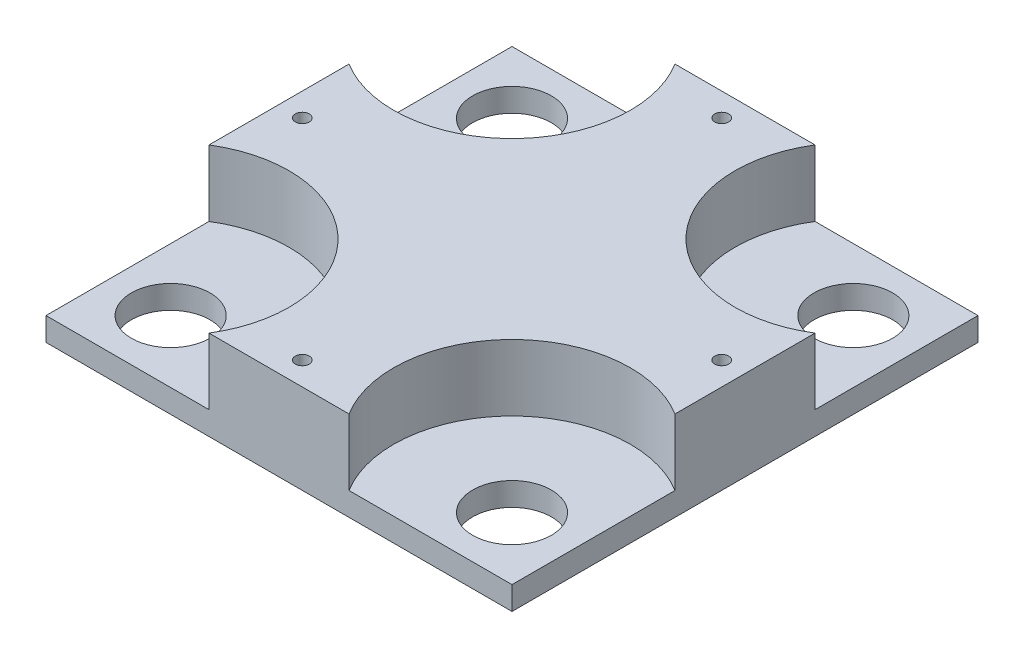
ISO-10303-21;
HEADER;
FILE_DESCRIPTION(('STEP AP214'),'2;1');
FILE_NAME('part.step','',(''),(''),'','','');
FILE_SCHEMA(('AUTOMOTIVE_DESIGN { 1 0 10303 214 1 1 1 1 }'));
ENDSEC;
DATA;
#1=APPLICATION_CONTEXT('core data for automotive mechanical design processes');
#2=APPLICATION_PROTOCOL_DEFINITION('international standard','automotive_design',2000,#1);
#3=PRODUCT_CONTEXT('',#1,'mechanical');
#4=PRODUCT('Part','Part','',(#3));
#5=PRODUCT_RELATED_PRODUCT_CATEGORY('part','',(#4));
#6=PRODUCT_DEFINITION_FORMATION('','',#4);
#7=PRODUCT_DEFINITION_CONTEXT('part definition',#1,'design');
#8=PRODUCT_DEFINITION('design','',#6,#7);
#9=PRODUCT_DEFINITION_SHAPE('','',#8);
#10=(LENGTH_UNIT() NAMED_UNIT(*) SI_UNIT(.MILLI.,.METRE.));
#11=(NAMED_UNIT(*) PLANE_ANGLE_UNIT() SI_UNIT($,.RADIAN.));
#12=(NAMED_UNIT(*) SI_UNIT($,.STERADIAN.) SOLID_ANGLE_UNIT());
#13=UNCERTAINTY_MEASURE_WITH_UNIT(LENGTH_MEASURE(1.E-05),#10,'distance_accuracy_value','');
#14=(GEOMETRIC_REPRESENTATION_CONTEXT(3) GLOBAL_UNCERTAINTY_ASSIGNED_CONTEXT((#13)) GLOBAL_UNIT_ASSIGNED_CONTEXT((#10,
#11,#12)) REPRESENTATION_CONTEXT('',''));
#15=CARTESIAN_POINT('',(0.,0.,0.));
#16=DIRECTION('',(0.,0.,1.));
#17=DIRECTION('',(1.,0.,0.));
#18=AXIS2_PLACEMENT_3D('',#15,#16,#17);
#19=CARTESIAN_POINT('',(0.,19.224,0.));
#20=DIRECTION('',(0.,-1.,0.));
#21=DIRECTION('',(0.,0.,-1.));
#22=AXIS2_PLACEMENT_3D('',#19,#20,#21);
#23=CYLINDRICAL_SURFACE('',#22,8.4375);
#24=CARTESIAN_POINT('',(0.,0.,0.));
#25=DIRECTION('',(0.,1.,0.));
#26=DIRECTION('',(0.,0.,1.));
#27=AXIS2_PLACEMENT_3D('',#24,#25,#26);
#28=CIRCLE('',#27,8.4375);
#29=CARTESIAN_POINT('',(0.,0.,8.4375));
#30=VERTEX_POINT('',#29);
#31=EDGE_CURVE('E177',#30,#30,#28,.T.);
#32=ORIENTED_EDGE('',*,*,#31,.F.);
#33=EDGE_LOOP('',(#32));
#34=FACE_BOUND('',#33,.T.);
#35=CARTESIAN_POINT('',(0.,5.,0.));
#36=DIRECTION('',(0.,1.,0.));
#37=DIRECTION('',(0.,0.,1.));
#38=AXIS2_PLACEMENT_3D('',#35,#36,#37);
#39=CIRCLE('',#38,8.4375);
#40=CARTESIAN_POINT('',(0.,5.,8.4375));
#41=VERTEX_POINT('',#40);
#42=EDGE_CURVE('E218',#41,#41,#39,.T.);
#43=ORIENTED_EDGE('',*,*,#42,.T.);
#44=EDGE_LOOP('',(#43));
#45=FACE_BOUND('',#44,.T.);
#46=ADVANCED_FACE('F39',(#34,#45),#23,.F.);
#47=CARTESIAN_POINT('',(9.64506252643105E-13,19.224,-73.250000000001));
#48=DIRECTION('',(0.,-1.,0.));
#49=DIRECTION('',(0.,0.,-1.));
#50=AXIS2_PLACEMENT_3D('',#47,#48,#49);
#51=CYLINDRICAL_SURFACE('',#50,8.43749999999876);
#52=CARTESIAN_POINT('',(9.64506252643105E-13,0.,-73.250000000001));
#53=DIRECTION('',(0.,1.,0.));
#54=DIRECTION('',(0.,0.,1.));
#55=AXIS2_PLACEMENT_3D('',#52,#53,#54);
#56=CIRCLE('',#55,8.43749999999876);
#57=CARTESIAN_POINT('',(9.64506252643105E-13,0.,-64.8125000000022));
#58=VERTEX_POINT('',#57);
#59=EDGE_CURVE('E300',#58,#58,#56,.T.);
#60=ORIENTED_EDGE('',*,*,#59,.F.);
#61=EDGE_LOOP('',(#60));
#62=FACE_BOUND('',#61,.T.);
#63=CARTESIAN_POINT('',(9.64506252643105E-13,5.,-73.250000000001));
#64=DIRECTION('',(0.,1.,0.));
#65=DIRECTION('',(0.,0.,1.));
#66=AXIS2_PLACEMENT_3D('',#63,#64,#65);
#67=CIRCLE('',#66,8.43749999999876);
#68=CARTESIAN_POINT('',(9.64506252643105E-13,5.,-64.8125000000022));
#69=VERTEX_POINT('',#68);
#70=EDGE_CURVE('E212',#69,#69,#67,.T.);
#71=ORIENTED_EDGE('',*,*,#70,.T.);
#72=EDGE_LOOP('',(#71));
#73=FACE_BOUND('',#72,.T.);
#74=ADVANCED_FACE('F364',(#62,#73),#51,.F.);
#75=CARTESIAN_POINT('',(73.250000000002,19.224,-73.25));
#76=DIRECTION('',(0.,-1.,0.));
#77=DIRECTION('',(0.,0.,-1.));
#78=AXIS2_PLACEMENT_3D('',#75,#76,#77);
#79=CYLINDRICAL_SURFACE('',#78,8.43749999999812);
#80=CARTESIAN_POINT('',(73.250000000002,0.,-73.25));
#81=DIRECTION('',(0.,1.,0.));
#82=DIRECTION('',(0.,0.,1.));
#83=AXIS2_PLACEMENT_3D('',#80,#81,#82);
#84=CIRCLE('',#83,8.43749999999812);
#85=CARTESIAN_POINT('',(73.250000000002,0.,-64.8125000000019));
#86=VERTEX_POINT('',#85);
#87=EDGE_CURVE('E296',#86,#86,#84,.T.);
#88=ORIENTED_EDGE('',*,*,#87,.F.);
#89=EDGE_LOOP('',(#88));
#90=FACE_BOUND('',#89,.T.);
#91=CARTESIAN_POINT('',(73.250000000002,5.,-73.25));
#92=DIRECTION('',(0.,1.,0.));
#93=DIRECTION('',(0.,0.,1.));
#94=AXIS2_PLACEMENT_3D('',#91,#92,#93);
#95=CIRCLE('',#94,8.43749999999812);
#96=CARTESIAN_POINT('',(73.250000000002,5.,-64.8125000000019));
#97=VERTEX_POINT('',#96);
#98=EDGE_CURVE('E207',#97,#97,#95,.T.);
#99=ORIENTED_EDGE('',*,*,#98,.T.);
#100=EDGE_LOOP('',(#99));
#101=FACE_BOUND('',#100,.T.);
#102=ADVANCED_FACE('F370',(#90,#101),#79,.F.);
#103=CARTESIAN_POINT('',(73.250000000001,19.224,9.71445146547012E-13));
#104=DIRECTION('',(0.,-1.,0.));
#105=DIRECTION('',(0.,0.,-1.));
#106=AXIS2_PLACEMENT_3D('',#103,#104,#105);
#107=CYLINDRICAL_SURFACE('',#106,8.43749999999931);
#108=CARTESIAN_POINT('',(73.250000000001,0.,9.71445146547012E-13));
#109=DIRECTION('',(0.,1.,0.));
#110=DIRECTION('',(0.,0.,1.));
#111=AXIS2_PLACEMENT_3D('',#108,#109,#110);
#112=CIRCLE('',#111,8.43749999999931);
#113=CARTESIAN_POINT('',(73.250000000001,0.,8.43750000000028));
#114=VERTEX_POINT('',#113);
#115=EDGE_CURVE('E292',#114,#114,#112,.T.);
#116=ORIENTED_EDGE('',*,*,#115,.F.);
#117=EDGE_LOOP('',(#116));
#118=FACE_BOUND('',#117,.T.);
#119=CARTESIAN_POINT('',(73.250000000001,5.,9.71445146547012E-13));
#120=DIRECTION('',(0.,1.,0.));
#121=DIRECTION('',(0.,0.,1.));
#122=AXIS2_PLACEMENT_3D('',#119,#120,#121);
#123=CIRCLE('',#122,8.43749999999931);
#124=CARTESIAN_POINT('',(73.250000000001,5.,8.43750000000028));
#125=VERTEX_POINT('',#124);
#126=EDGE_CURVE('E201',#125,#125,#123,.T.);
#127=ORIENTED_EDGE('',*,*,#126,.T.);
#128=EDGE_LOOP('',(#127));
#129=FACE_BOUND('',#128,.T.);
#130=ADVANCED_FACE('F379',(#118,#129),#107,.F.);
#131=CARTESIAN_POINT('',(0.,19.224,0.));
#132=DIRECTION('',(0.,1.,0.));
#133=DIRECTION('',(0.,0.,1.));
#134=AXIS2_PLACEMENT_3D('',#131,#132,#133);
#135=PLANE('',#134);
#136=CARTESIAN_POINT('',(36.625,19.224,-81.625));
#137=DIRECTION('',(0.,1.,0.));
#138=DIRECTION('',(0.,0.,1.));
#139=AXIS2_PLACEMENT_3D('',#136,#137,#138);
#140=CIRCLE('',#139,1.5);
#141=CARTESIAN_POINT('',(36.625,19.224,-80.125));
#142=VERTEX_POINT('',#141);
#143=EDGE_CURVE('E235',#142,#142,#140,.T.);
#144=ORIENTED_EDGE('',*,*,#143,.F.);
#145=EDGE_LOOP('',(#144));
#146=FACE_BOUND('',#145,.T.);
#147=CARTESIAN_POINT('',(81.6250000000007,19.224,-36.625));
#148=DIRECTION('',(0.,1.,0.));
#149=DIRECTION('',(0.,0.,1.));
#150=AXIS2_PLACEMENT_3D('',#147,#148,#149);
#151=CIRCLE('',#150,1.5);
#152=CARTESIAN_POINT('',(81.6250000000007,19.224,-35.125));
#153=VERTEX_POINT('',#152);
#154=EDGE_CURVE('E525',#153,#153,#151,.T.);
#155=ORIENTED_EDGE('',*,*,#154,.F.);
#156=EDGE_LOOP('',(#155));
#157=FACE_BOUND('',#156,.T.);
#158=CARTESIAN_POINT('',(36.6250000000006,19.224,8.37500000000002));
#159=DIRECTION('',(0.,1.,0.));
#160=DIRECTION('',(0.,0.,1.));
#161=AXIS2_PLACEMENT_3D('',#158,#159,#160);
#162=CIRCLE('',#161,1.5);
#163=CARTESIAN_POINT('',(36.6250000000006,19.224,9.87500000000003));
#164=VERTEX_POINT('',#163);
#165=EDGE_CURVE('E529',#164,#164,#162,.T.);
#166=ORIENTED_EDGE('',*,*,#165,.F.);
#167=EDGE_LOOP('',(#166));
#168=FACE_BOUND('',#167,.T.);
#169=CARTESIAN_POINT('',(-8.37499999999937,19.224,-36.625));
#170=DIRECTION('',(0.,1.,0.));
#171=DIRECTION('',(0.,0.,1.));
#172=AXIS2_PLACEMENT_3D('',#169,#170,#171);
#173=CIRCLE('',#172,1.50000000000001);
#174=CARTESIAN_POINT('',(-8.37499999999937,19.224,-35.125));
#175=VERTEX_POINT('',#174);
#176=EDGE_CURVE('E332',#175,#175,#173,.T.);
#177=ORIENTED_EDGE('',*,*,#176,.F.);
#178=EDGE_LOOP('',(#177));
#179=FACE_BOUND('',#178,.T.);
#180=CARTESIAN_POINT('',(0.,19.224,-73.25));
#181=DIRECTION('',(0.,1.,0.));
#182=DIRECTION('',(0.,0.,1.));
#183=AXIS2_PLACEMENT_3D('',#180,#181,#182);
#184=CIRCLE('',#183,25.4);
#185=CARTESIAN_POINT('',(-13.3749999999994,19.224,-51.6567284785279));
#186=VERTEX_POINT('',#185);
#187=CARTESIAN_POINT('',(21.5932715214717,19.224,-86.625));
#188=VERTEX_POINT('',#187);
#189=EDGE_CURVE('E245',#186,#188,#184,.T.);
#190=ORIENTED_EDGE('',*,*,#189,.F.);
#191=DIRECTION('',(0.,0.,1.));
#192=VECTOR('',#191,1.);
#193=CARTESIAN_POINT('',(-13.374999999999,19.224,-86.625));
#194=LINE('',#193,#192);
#195=CARTESIAN_POINT('',(-13.3749999999997,19.224,-21.5932715214719));
#196=VERTEX_POINT('',#195);
#197=EDGE_CURVE('E168',#186,#196,#194,.T.);
#198=ORIENTED_EDGE('',*,*,#197,.T.);
#199=CARTESIAN_POINT('',(0.,19.224,0.));
#200=DIRECTION('',(0.,1.,0.));
#201=DIRECTION('',(0.,0.,1.));
#202=AXIS2_PLACEMENT_3D('',#199,#200,#201);
#203=CIRCLE('',#202,25.4);
#204=CARTESIAN_POINT('',(21.5932715214717,19.224,13.375));
#205=VERTEX_POINT('',#204);
#206=EDGE_CURVE('E260',#205,#196,#203,.T.);
#207=ORIENTED_EDGE('',*,*,#206,.F.);
#208=DIRECTION('',(1.,0.,0.));
#209=VECTOR('',#208,1.);
#210=CARTESIAN_POINT('',(-13.375,19.224,13.375));
#211=LINE('',#210,#209);
#212=CARTESIAN_POINT('',(51.6567284785325,19.224,13.375));
#213=VERTEX_POINT('',#212);
#214=EDGE_CURVE('E152',#205,#213,#211,.T.);
#215=ORIENTED_EDGE('',*,*,#214,.T.);
#216=CARTESIAN_POINT('',(73.250000000002,19.224,0.));
#217=DIRECTION('',(0.,1.,0.));
#218=DIRECTION('',(0.,0.,1.));
#219=AXIS2_PLACEMENT_3D('',#216,#217,#218);
#220=CIRCLE('',#219,25.3999999999981);
#221=CARTESIAN_POINT('',(86.625,19.224,-21.5932715214707));
#222=VERTEX_POINT('',#221);
#223=EDGE_CURVE('E135',#222,#213,#220,.T.);
#224=ORIENTED_EDGE('',*,*,#223,.F.);
#225=DIRECTION('',(0.,0.,-1.));
#226=VECTOR('',#225,1.);
#227=CARTESIAN_POINT('',(86.625,19.224,-86.625));
#228=LINE('',#227,#226);
#229=CARTESIAN_POINT('',(86.625,19.224,-51.6567284785293));
#230=VERTEX_POINT('',#229);
#231=EDGE_CURVE('E149',#222,#230,#228,.T.);
#232=ORIENTED_EDGE('',*,*,#231,.T.);
#233=CARTESIAN_POINT('',(73.250000000002,19.224,-73.25));
#234=DIRECTION('',(0.,1.,0.));
#235=DIRECTION('',(0.,0.,1.));
#236=AXIS2_PLACEMENT_3D('',#233,#234,#235);
#237=CIRCLE('',#236,25.3999999999981);
#238=CARTESIAN_POINT('',(51.6567284785325,19.224,-86.625));
#239=VERTEX_POINT('',#238);
#240=EDGE_CURVE('E254',#239,#230,#237,.T.);
#241=ORIENTED_EDGE('',*,*,#240,.F.);
#242=DIRECTION('',(-1.,0.,0.));
#243=VECTOR('',#242,1.);
#244=CARTESIAN_POINT('',(-13.374999999999,19.224,-86.625));
#245=LINE('',#244,#243);
#246=EDGE_CURVE('E161',#239,#188,#245,.T.);
#247=ORIENTED_EDGE('',*,*,#246,.T.);
#248=EDGE_LOOP('',(#190,#198,#207,#215,#224,#232,#241,#247));
#249=FACE_BOUND('',#248,.T.);
#250=ADVANCED_FACE('F147',(#146,#157,#168,#179,#249),#135,.T.);
#251=CARTESIAN_POINT('',(0.,0.,0.));
#252=DIRECTION('',(0.,1.,0.));
#253=DIRECTION('',(0.,0.,1.));
#254=AXIS2_PLACEMENT_3D('',#251,#252,#253);
#255=PLANE('',#254);
#256=CARTESIAN_POINT('',(36.625,0.,-81.625));
#257=DIRECTION('',(0.,1.,0.));
#258=DIRECTION('',(0.,0.,1.));
#259=AXIS2_PLACEMENT_3D('',#256,#257,#258);
#260=CIRCLE('',#259,1.5);
#261=CARTESIAN_POINT('',(36.625,0.,-80.125));
#262=VERTEX_POINT('',#261);
#263=EDGE_CURVE('E43',#262,#262,#260,.F.);
#264=ORIENTED_EDGE('',*,*,#263,.F.);
#265=EDGE_LOOP('',(#264));
#266=FACE_BOUND('',#265,.T.);
#267=CARTESIAN_POINT('',(81.6250000000007,0.,-36.625));
#268=DIRECTION('',(0.,1.,0.));
#269=DIRECTION('',(0.,0.,1.));
#270=AXIS2_PLACEMENT_3D('',#267,#268,#269);
#271=CIRCLE('',#270,1.5);
#272=CARTESIAN_POINT('',(81.6250000000007,0.,-35.125));
#273=VERTEX_POINT('',#272);
#274=EDGE_CURVE('E238',#273,#273,#271,.F.);
#275=ORIENTED_EDGE('',*,*,#274,.F.);
#276=EDGE_LOOP('',(#275));
#277=FACE_BOUND('',#276,.T.);
#278=CARTESIAN_POINT('',(36.6250000000006,0.,8.37500000000002));
#279=DIRECTION('',(0.,1.,0.));
#280=DIRECTION('',(0.,0.,1.));
#281=AXIS2_PLACEMENT_3D('',#278,#279,#280);
#282=CIRCLE('',#281,1.5);
#283=CARTESIAN_POINT('',(36.6250000000006,0.,9.87500000000003));
#284=VERTEX_POINT('',#283);
#285=EDGE_CURVE('E234',#284,#284,#282,.F.);
#286=ORIENTED_EDGE('',*,*,#285,.F.);
#287=EDGE_LOOP('',(#286));
#288=FACE_BOUND('',#287,.T.);
#289=CARTESIAN_POINT('',(-8.37499999999937,0.,-36.625));
#290=DIRECTION('',(0.,1.,0.));
#291=DIRECTION('',(0.,0.,1.));
#292=AXIS2_PLACEMENT_3D('',#289,#290,#291);
#293=CIRCLE('',#292,1.50000000000001);
#294=CARTESIAN_POINT('',(-8.37499999999937,0.,-35.125));
#295=VERTEX_POINT('',#294);
#296=EDGE_CURVE('E230',#295,#295,#293,.F.);
#297=ORIENTED_EDGE('',*,*,#296,.F.);
#298=EDGE_LOOP('',(#297));
#299=FACE_BOUND('',#298,.T.);
#300=DIRECTION('',(0.,0.,1.));
#301=VECTOR('',#300,1.);
#302=CARTESIAN_POINT('',(-13.374999999999,0.,-86.625));
#303=LINE('',#302,#301);
#304=CARTESIAN_POINT('',(-13.374999999999,0.,-86.625));
#305=VERTEX_POINT('',#304);
#306=CARTESIAN_POINT('',(-13.375,0.,13.375));
#307=VERTEX_POINT('',#306);
#308=EDGE_CURVE('E172',#305,#307,#303,.T.);
#309=ORIENTED_EDGE('',*,*,#308,.F.);
#310=DIRECTION('',(-1.,0.,0.));
#311=VECTOR('',#310,1.);
#312=CARTESIAN_POINT('',(-13.374999999999,0.,-86.625));
#313=LINE('',#312,#311);
#314=CARTESIAN_POINT('',(86.625,0.,-86.625));
#315=VERTEX_POINT('',#314);
#316=EDGE_CURVE('E185',#315,#305,#313,.T.);
#317=ORIENTED_EDGE('',*,*,#316,.F.);
#318=DIRECTION('',(0.,0.,-1.));
#319=VECTOR('',#318,1.);
#320=CARTESIAN_POINT('',(86.625,0.,-86.625));
#321=LINE('',#320,#319);
#322=CARTESIAN_POINT('',(86.625,0.,13.375));
#323=VERTEX_POINT('',#322);
#324=EDGE_CURVE('E181',#323,#315,#321,.T.);
#325=ORIENTED_EDGE('',*,*,#324,.F.);
#326=DIRECTION('',(1.,0.,0.));
#327=VECTOR('',#326,1.);
#328=CARTESIAN_POINT('',(-13.375,0.,13.375));
#329=LINE('',#328,#327);
#330=EDGE_CURVE('E176',#307,#323,#329,.T.);
#331=ORIENTED_EDGE('',*,*,#330,.F.);
#332=EDGE_LOOP('',(#309,#317,#325,#331));
#333=FACE_BOUND('',#332,.T.);
#334=ORIENTED_EDGE('',*,*,#31,.T.);
#335=EDGE_LOOP('',(#334));
#336=FACE_BOUND('',#335,.T.);
#337=ORIENTED_EDGE('',*,*,#59,.T.);
#338=EDGE_LOOP('',(#337));
#339=FACE_BOUND('',#338,.T.);
#340=ORIENTED_EDGE('',*,*,#87,.T.);
#341=EDGE_LOOP('',(#340));
#342=FACE_BOUND('',#341,.T.);
#343=ORIENTED_EDGE('',*,*,#115,.T.);
#344=EDGE_LOOP('',(#343));
#345=FACE_BOUND('',#344,.T.);
#346=ADVANCED_FACE('F323',(#266,#277,#288,#299,#333,#336,#339,#342,#345),#255,.F.);
#347=CARTESIAN_POINT('',(-13.374999999999,19.224,-86.625));
#348=DIRECTION('',(1.,0.,0.));
#349=DIRECTION('',(0.,0.,-1.));
#350=AXIS2_PLACEMENT_3D('',#347,#348,#349);
#351=PLANE('',#350);
#352=ORIENTED_EDGE('',*,*,#197,.F.);
#353=DIRECTION('',(0.,1.,0.));
#354=VECTOR('',#353,1.);
#355=CARTESIAN_POINT('',(-13.3749999999994,5.,-51.6567284785279));
#356=LINE('',#355,#354);
#357=CARTESIAN_POINT('',(-13.3749999999994,5.,-51.6567284785279));
#358=VERTEX_POINT('',#357);
#359=EDGE_CURVE('E281',#186,#358,#356,.F.);
#360=ORIENTED_EDGE('',*,*,#359,.T.);
#361=DIRECTION('',(0.,0.,1.));
#362=VECTOR('',#361,1.);
#363=CARTESIAN_POINT('',(-13.374999999999,5.,-86.625));
#364=LINE('',#363,#362);
#365=CARTESIAN_POINT('',(-13.374999999999,5.,-86.625));
#366=VERTEX_POINT('',#365);
#367=EDGE_CURVE('E223',#366,#358,#364,.T.);
#368=ORIENTED_EDGE('',*,*,#367,.F.);
#369=DIRECTION('',(0.,-1.,0.));
#370=VECTOR('',#369,1.);
#371=CARTESIAN_POINT('',(-13.374999999999,19.224,-86.625));
#372=LINE('',#371,#370);
#373=EDGE_CURVE('E166',#366,#305,#372,.T.);
#374=ORIENTED_EDGE('',*,*,#373,.T.);
#375=ORIENTED_EDGE('',*,*,#308,.T.);
#376=DIRECTION('',(0.,-1.,0.));
#377=VECTOR('',#376,1.);
#378=CARTESIAN_POINT('',(-13.375,19.224,13.375));
#379=LINE('',#378,#377);
#380=CARTESIAN_POINT('',(-13.375,5.,13.375));
#381=VERTEX_POINT('',#380);
#382=EDGE_CURVE('E197',#381,#307,#379,.T.);
#383=ORIENTED_EDGE('',*,*,#382,.F.);
#384=DIRECTION('',(0.,0.,1.));
#385=VECTOR('',#384,1.);
#386=CARTESIAN_POINT('',(-13.374999999999,5.,-86.625));
#387=LINE('',#386,#385);
#388=CARTESIAN_POINT('',(-13.3749999999997,5.,-21.5932715214719));
#389=VERTEX_POINT('',#388);
#390=EDGE_CURVE('E57',#389,#381,#387,.T.);
#391=ORIENTED_EDGE('',*,*,#390,.F.);
#392=DIRECTION('',(0.,1.,0.));
#393=VECTOR('',#392,1.);
#394=CARTESIAN_POINT('',(-13.3749999999997,5.,-21.5932715214719));
#395=LINE('',#394,#393);
#396=EDGE_CURVE('E288',#389,#196,#395,.T.);
#397=ORIENTED_EDGE('',*,*,#396,.T.);
#398=EDGE_LOOP('',(#352,#360,#368,#374,#375,#383,#391,#397));
#399=FACE_BOUND('',#398,.T.);
#400=ADVANCED_FACE('F41',(#399),#351,.F.);
#401=CARTESIAN_POINT('',(-13.375,19.224,13.375));
#402=DIRECTION('',(0.,0.,-1.));
#403=DIRECTION('',(-1.,0.,0.));
#404=AXIS2_PLACEMENT_3D('',#401,#402,#403);
#405=PLANE('',#404);
#406=DIRECTION('',(1.,0.,0.));
#407=VECTOR('',#406,1.);
#408=CARTESIAN_POINT('',(-13.375,5.,13.375));
#409=LINE('',#408,#407);
#410=CARTESIAN_POINT('',(51.6567284785325,5.,13.375));
#411=VERTEX_POINT('',#410);
#412=CARTESIAN_POINT('',(86.625,5.,13.375));
#413=VERTEX_POINT('',#412);
#414=EDGE_CURVE('E65',#411,#413,#409,.T.);
#415=ORIENTED_EDGE('',*,*,#414,.F.);
#416=DIRECTION('',(0.,1.,0.));
#417=VECTOR('',#416,1.);
#418=CARTESIAN_POINT('',(51.6567284785325,5.,13.375));
#419=LINE('',#418,#417);
#420=EDGE_CURVE('E285',#411,#213,#419,.T.);
#421=ORIENTED_EDGE('',*,*,#420,.T.);
#422=ORIENTED_EDGE('',*,*,#214,.F.);
#423=DIRECTION('',(0.,1.,0.));
#424=VECTOR('',#423,1.);
#425=CARTESIAN_POINT('',(21.5932715214717,5.,13.375));
#426=LINE('',#425,#424);
#427=CARTESIAN_POINT('',(21.5932715214717,5.,13.375));
#428=VERTEX_POINT('',#427);
#429=EDGE_CURVE('E11',#205,#428,#426,.F.);
#430=ORIENTED_EDGE('',*,*,#429,.T.);
#431=DIRECTION('',(1.,0.,0.));
#432=VECTOR('',#431,1.);
#433=CARTESIAN_POINT('',(-13.375,5.,13.375));
#434=LINE('',#433,#432);
#435=EDGE_CURVE('E222',#381,#428,#434,.T.);
#436=ORIENTED_EDGE('',*,*,#435,.F.);
#437=ORIENTED_EDGE('',*,*,#382,.T.);
#438=ORIENTED_EDGE('',*,*,#330,.T.);
#439=DIRECTION('',(0.,-1.,0.));
#440=VECTOR('',#439,1.);
#441=CARTESIAN_POINT('',(86.625,19.224,13.375));
#442=LINE('',#441,#440);
#443=EDGE_CURVE('E194',#413,#323,#442,.T.);
#444=ORIENTED_EDGE('',*,*,#443,.F.);
#445=EDGE_LOOP('',(#415,#421,#422,#430,#436,#437,#438,#444));
#446=FACE_BOUND('',#445,.T.);
#447=ADVANCED_FACE('F317',(#446),#405,.F.);
#448=CARTESIAN_POINT('',(86.625,19.224,-86.625));
#449=DIRECTION('',(-1.,0.,0.));
#450=DIRECTION('',(0.,0.,1.));
#451=AXIS2_PLACEMENT_3D('',#448,#449,#450);
#452=PLANE('',#451);
#453=DIRECTION('',(0.,0.,-1.));
#454=VECTOR('',#453,1.);
#455=CARTESIAN_POINT('',(86.625,5.,-86.625));
#456=LINE('',#455,#454);
#457=CARTESIAN_POINT('',(86.625,5.,-51.6567284785293));
#458=VERTEX_POINT('',#457);
#459=CARTESIAN_POINT('',(86.625,5.,-86.625));
#460=VERTEX_POINT('',#459);
#461=EDGE_CURVE('E217',#458,#460,#456,.T.);
#462=ORIENTED_EDGE('',*,*,#461,.F.);
#463=DIRECTION('',(0.,1.,0.));
#464=VECTOR('',#463,1.);
#465=CARTESIAN_POINT('',(86.625,5.,-51.6567284785293));
#466=LINE('',#465,#464);
#467=EDGE_CURVE('E159',#458,#230,#466,.T.);
#468=ORIENTED_EDGE('',*,*,#467,.T.);
#469=ORIENTED_EDGE('',*,*,#231,.F.);
#470=DIRECTION('',(0.,1.,0.));
#471=VECTOR('',#470,1.);
#472=CARTESIAN_POINT('',(86.625,5.,-21.5932715214707));
#473=LINE('',#472,#471);
#474=CARTESIAN_POINT('',(86.625,5.,-21.5932715214707));
#475=VERTEX_POINT('',#474);
#476=EDGE_CURVE('E49',#222,#475,#473,.F.);
#477=ORIENTED_EDGE('',*,*,#476,.T.);
#478=DIRECTION('',(0.,0.,-1.));
#479=VECTOR('',#478,1.);
#480=CARTESIAN_POINT('',(86.625,5.,-86.625));
#481=LINE('',#480,#479);
#482=EDGE_CURVE('E205',#413,#475,#481,.T.);
#483=ORIENTED_EDGE('',*,*,#482,.F.);
#484=ORIENTED_EDGE('',*,*,#443,.T.);
#485=ORIENTED_EDGE('',*,*,#324,.T.);
#486=DIRECTION('',(0.,-1.,0.));
#487=VECTOR('',#486,1.);
#488=CARTESIAN_POINT('',(86.625,19.224,-86.625));
#489=LINE('',#488,#487);
#490=EDGE_CURVE('E191',#460,#315,#489,.T.);
#491=ORIENTED_EDGE('',*,*,#490,.F.);
#492=EDGE_LOOP('',(#462,#468,#469,#477,#483,#484,#485,#491));
#493=FACE_BOUND('',#492,.T.);
#494=ADVANCED_FACE('F158',(#493),#452,.F.);
#495=CARTESIAN_POINT('',(-13.374999999999,19.224,-86.625));
#496=DIRECTION('',(0.,0.,1.));
#497=DIRECTION('',(1.,0.,0.));
#498=AXIS2_PLACEMENT_3D('',#495,#496,#497);
#499=PLANE('',#498);
#500=DIRECTION('',(-1.,0.,0.));
#501=VECTOR('',#500,1.);
#502=CARTESIAN_POINT('',(-13.374999999999,5.,-86.625));
#503=LINE('',#502,#501);
#504=CARTESIAN_POINT('',(21.5932715214717,5.,-86.625));
#505=VERTEX_POINT('',#504);
#506=EDGE_CURVE('E216',#505,#366,#503,.T.);
#507=ORIENTED_EDGE('',*,*,#506,.F.);
#508=DIRECTION('',(0.,1.,0.));
#509=VECTOR('',#508,1.);
#510=CARTESIAN_POINT('',(21.5932715214717,5.,-86.625));
#511=LINE('',#510,#509);
#512=EDGE_CURVE('E141',#505,#188,#511,.T.);
#513=ORIENTED_EDGE('',*,*,#512,.T.);
#514=ORIENTED_EDGE('',*,*,#246,.F.);
#515=DIRECTION('',(0.,1.,0.));
#516=VECTOR('',#515,1.);
#517=CARTESIAN_POINT('',(51.6567284785325,5.,-86.625));
#518=LINE('',#517,#516);
#519=CARTESIAN_POINT('',(51.6567284785325,5.,-86.625));
#520=VERTEX_POINT('',#519);
#521=EDGE_CURVE('E200',#239,#520,#518,.F.);
#522=ORIENTED_EDGE('',*,*,#521,.T.);
#523=DIRECTION('',(-1.,0.,0.));
#524=VECTOR('',#523,1.);
#525=CARTESIAN_POINT('',(-13.374999999999,5.,-86.625));
#526=LINE('',#525,#524);
#527=EDGE_CURVE('E211',#460,#520,#526,.T.);
#528=ORIENTED_EDGE('',*,*,#527,.F.);
#529=ORIENTED_EDGE('',*,*,#490,.T.);
#530=ORIENTED_EDGE('',*,*,#316,.T.);
#531=ORIENTED_EDGE('',*,*,#373,.F.);
#532=EDGE_LOOP('',(#507,#513,#514,#522,#528,#529,#530,#531));
#533=FACE_BOUND('',#532,.T.);
#534=ADVANCED_FACE('F344',(#533),#499,.F.);
#535=CARTESIAN_POINT('',(73.250000000002,5.,0.));
#536=DIRECTION('',(0.,1.,0.));
#537=DIRECTION('',(0.,0.,1.));
#538=AXIS2_PLACEMENT_3D('',#535,#536,#537);
#539=CYLINDRICAL_SURFACE('',#538,25.3999999999981);
#540=CARTESIAN_POINT('',(73.250000000002,5.,0.));
#541=DIRECTION('',(0.,1.,0.));
#542=DIRECTION('',(0.,0.,1.));
#543=AXIS2_PLACEMENT_3D('',#540,#541,#542);
#544=CIRCLE('',#543,25.3999999999981);
#545=EDGE_CURVE('E137',#475,#411,#544,.T.);
#546=ORIENTED_EDGE('',*,*,#545,.F.);
#547=ORIENTED_EDGE('',*,*,#476,.F.);
#548=ORIENTED_EDGE('',*,*,#223,.T.);
#549=ORIENTED_EDGE('',*,*,#420,.F.);
#550=EDGE_LOOP('',(#546,#547,#548,#549));
#551=FACE_BOUND('',#550,.T.);
#552=ADVANCED_FACE('F134',(#551),#539,.F.);
#553=CARTESIAN_POINT('',(73.250000000002,5.,0.));
#554=DIRECTION('',(0.,1.,0.));
#555=DIRECTION('',(0.,0.,1.));
#556=AXIS2_PLACEMENT_3D('',#553,#554,#555);
#557=PLANE('',#556);
#558=ORIENTED_EDGE('',*,*,#126,.F.);
#559=EDGE_LOOP('',(#558));
#560=FACE_BOUND('',#559,.T.);
#561=ORIENTED_EDGE('',*,*,#414,.T.);
#562=ORIENTED_EDGE('',*,*,#482,.T.);
#563=ORIENTED_EDGE('',*,*,#545,.T.);
#564=EDGE_LOOP('',(#561,#562,#563));
#565=FACE_BOUND('',#564,.T.);
#566=ADVANCED_FACE('F328',(#560,#565),#557,.T.);
#567=CARTESIAN_POINT('',(73.250000000002,5.,-73.25));
#568=DIRECTION('',(0.,1.,0.));
#569=DIRECTION('',(0.,0.,1.));
#570=AXIS2_PLACEMENT_3D('',#567,#568,#569);
#571=CYLINDRICAL_SURFACE('',#570,25.3999999999981);
#572=CARTESIAN_POINT('',(73.250000000002,5.,-73.25));
#573=DIRECTION('',(0.,1.,0.));
#574=DIRECTION('',(0.,0.,1.));
#575=AXIS2_PLACEMENT_3D('',#572,#573,#574);
#576=CIRCLE('',#575,25.3999999999981);
#577=EDGE_CURVE('E154',#520,#458,#576,.T.);
#578=ORIENTED_EDGE('',*,*,#577,.F.);
#579=ORIENTED_EDGE('',*,*,#521,.F.);
#580=ORIENTED_EDGE('',*,*,#240,.T.);
#581=ORIENTED_EDGE('',*,*,#467,.F.);
#582=EDGE_LOOP('',(#578,#579,#580,#581));
#583=FACE_BOUND('',#582,.T.);
#584=ADVANCED_FACE('F340',(#583),#571,.F.);
#585=CARTESIAN_POINT('',(73.250000000002,5.,-73.25));
#586=DIRECTION('',(0.,1.,0.));
#587=DIRECTION('',(0.,0.,1.));
#588=AXIS2_PLACEMENT_3D('',#585,#586,#587);
#589=PLANE('',#588);
#590=ORIENTED_EDGE('',*,*,#98,.F.);
#591=EDGE_LOOP('',(#590));
#592=FACE_BOUND('',#591,.T.);
#593=ORIENTED_EDGE('',*,*,#461,.T.);
#594=ORIENTED_EDGE('',*,*,#527,.T.);
#595=ORIENTED_EDGE('',*,*,#577,.T.);
#596=EDGE_LOOP('',(#593,#594,#595));
#597=FACE_BOUND('',#596,.T.);
#598=ADVANCED_FACE('F351',(#592,#597),#589,.T.);
#599=CARTESIAN_POINT('',(0.,5.,-73.25));
#600=DIRECTION('',(0.,1.,0.));
#601=DIRECTION('',(0.,0.,1.));
#602=AXIS2_PLACEMENT_3D('',#599,#600,#601);
#603=CYLINDRICAL_SURFACE('',#602,25.4);
#604=ORIENTED_EDGE('',*,*,#189,.T.);
#605=ORIENTED_EDGE('',*,*,#512,.F.);
#606=CARTESIAN_POINT('',(0.,5.,-73.25));
#607=DIRECTION('',(0.,1.,0.));
#608=DIRECTION('',(0.,0.,1.));
#609=AXIS2_PLACEMENT_3D('',#606,#607,#608);
#610=CIRCLE('',#609,25.4);
#611=EDGE_CURVE('E249',#358,#505,#610,.T.);
#612=ORIENTED_EDGE('',*,*,#611,.F.);
#613=ORIENTED_EDGE('',*,*,#359,.F.);
#614=EDGE_LOOP('',(#604,#605,#612,#613));
#615=FACE_BOUND('',#614,.T.);
#616=ADVANCED_FACE('F347',(#615),#603,.F.);
#617=CARTESIAN_POINT('',(0.,5.,-73.25));
#618=DIRECTION('',(0.,1.,0.));
#619=DIRECTION('',(0.,0.,1.));
#620=AXIS2_PLACEMENT_3D('',#617,#618,#619);
#621=PLANE('',#620);
#622=ORIENTED_EDGE('',*,*,#70,.F.);
#623=EDGE_LOOP('',(#622));
#624=FACE_BOUND('',#623,.T.);
#625=ORIENTED_EDGE('',*,*,#367,.T.);
#626=ORIENTED_EDGE('',*,*,#611,.T.);
#627=ORIENTED_EDGE('',*,*,#506,.T.);
#628=EDGE_LOOP('',(#625,#626,#627));
#629=FACE_BOUND('',#628,.T.);
#630=ADVANCED_FACE('F349',(#624,#629),#621,.T.);
#631=CARTESIAN_POINT('',(0.,5.,0.));
#632=DIRECTION('',(0.,1.,0.));
#633=DIRECTION('',(0.,0.,1.));
#634=AXIS2_PLACEMENT_3D('',#631,#632,#633);
#635=CYLINDRICAL_SURFACE('',#634,25.4);
#636=CARTESIAN_POINT('',(0.,5.,0.));
#637=DIRECTION('',(0.,1.,0.));
#638=DIRECTION('',(0.,0.,1.));
#639=AXIS2_PLACEMENT_3D('',#636,#637,#638);
#640=CIRCLE('',#639,25.4);
#641=EDGE_CURVE('E206',#428,#389,#640,.T.);
#642=ORIENTED_EDGE('',*,*,#641,.F.);
#643=ORIENTED_EDGE('',*,*,#429,.F.);
#644=ORIENTED_EDGE('',*,*,#206,.T.);
#645=ORIENTED_EDGE('',*,*,#396,.F.);
#646=EDGE_LOOP('',(#642,#643,#644,#645));
#647=FACE_BOUND('',#646,.T.);
#648=ADVANCED_FACE('F314',(#647),#635,.F.);
#649=CARTESIAN_POINT('',(0.,5.,0.));
#650=DIRECTION('',(0.,1.,0.));
#651=DIRECTION('',(0.,0.,1.));
#652=AXIS2_PLACEMENT_3D('',#649,#650,#651);
#653=PLANE('',#652);
#654=ORIENTED_EDGE('',*,*,#42,.F.);
#655=EDGE_LOOP('',(#654));
#656=FACE_BOUND('',#655,.T.);
#657=ORIENTED_EDGE('',*,*,#390,.T.);
#658=ORIENTED_EDGE('',*,*,#435,.T.);
#659=ORIENTED_EDGE('',*,*,#641,.T.);
#660=EDGE_LOOP('',(#657,#658,#659));
#661=FACE_BOUND('',#660,.T.);
#662=ADVANCED_FACE('F315',(#656,#661),#653,.T.);
#663=CARTESIAN_POINT('',(-8.37499999999937,19.224,-36.625));
#664=DIRECTION('',(0.,-1.,0.));
#665=DIRECTION('',(0.,0.,-1.));
#666=AXIS2_PLACEMENT_3D('',#663,#664,#665);
#667=CYLINDRICAL_SURFACE('',#666,1.50000000000001);
#668=ORIENTED_EDGE('',*,*,#176,.T.);
#669=EDGE_LOOP('',(#668));
#670=FACE_BOUND('',#669,.T.);
#671=ORIENTED_EDGE('',*,*,#296,.T.);
#672=EDGE_LOOP('',(#671));
#673=FACE_BOUND('',#672,.T.);
#674=ADVANCED_FACE('F477',(#670,#673),#667,.F.);
#675=CARTESIAN_POINT('',(36.6250000000006,19.224,8.37500000000002));
#676=DIRECTION('',(0.,-1.,0.));
#677=DIRECTION('',(0.,0.,-1.));
#678=AXIS2_PLACEMENT_3D('',#675,#676,#677);
#679=CYLINDRICAL_SURFACE('',#678,1.5);
#680=ORIENTED_EDGE('',*,*,#165,.T.);
#681=EDGE_LOOP('',(#680));
#682=FACE_BOUND('',#681,.T.);
#683=ORIENTED_EDGE('',*,*,#285,.T.);
#684=EDGE_LOOP('',(#683));
#685=FACE_BOUND('',#684,.T.);
#686=ADVANCED_FACE('F485',(#682,#685),#679,.F.);
#687=CARTESIAN_POINT('',(81.6250000000007,19.224,-36.625));
#688=DIRECTION('',(0.,-1.,0.));
#689=DIRECTION('',(0.,0.,-1.));
#690=AXIS2_PLACEMENT_3D('',#687,#688,#689);
#691=CYLINDRICAL_SURFACE('',#690,1.5);
#692=ORIENTED_EDGE('',*,*,#154,.T.);
#693=EDGE_LOOP('',(#692));
#694=FACE_BOUND('',#693,.T.);
#695=ORIENTED_EDGE('',*,*,#274,.T.);
#696=EDGE_LOOP('',(#695));
#697=FACE_BOUND('',#696,.T.);
#698=ADVANCED_FACE('F494',(#694,#697),#691,.F.);
#699=CARTESIAN_POINT('',(36.625,19.224,-81.625));
#700=DIRECTION('',(0.,-1.,0.));
#701=DIRECTION('',(0.,0.,-1.));
#702=AXIS2_PLACEMENT_3D('',#699,#700,#701);
#703=CYLINDRICAL_SURFACE('',#702,1.5);
#704=ORIENTED_EDGE('',*,*,#143,.T.);
#705=EDGE_LOOP('',(#704));
#706=FACE_BOUND('',#705,.T.);
#707=ORIENTED_EDGE('',*,*,#263,.T.);
#708=EDGE_LOOP('',(#707));
#709=FACE_BOUND('',#708,.T.);
#710=ADVANCED_FACE('F503',(#706,#709),#703,.F.);
#711=CLOSED_SHELL('',(#46,#74,#102,#130,#250,#346,#400,#447,#494,#534,#552,#566,#584,#598,#616,
#630,#648,#662,#674,#686,#698,#710));
#712=MANIFOLD_SOLID_BREP('B2',#711);
#713=ADVANCED_BREP_SHAPE_REPRESENTATION('',(#18,#712),#14);
#714=SHAPE_DEFINITION_REPRESENTATION(#9,#713);
ENDSEC;
END-ISO-10303-21;
